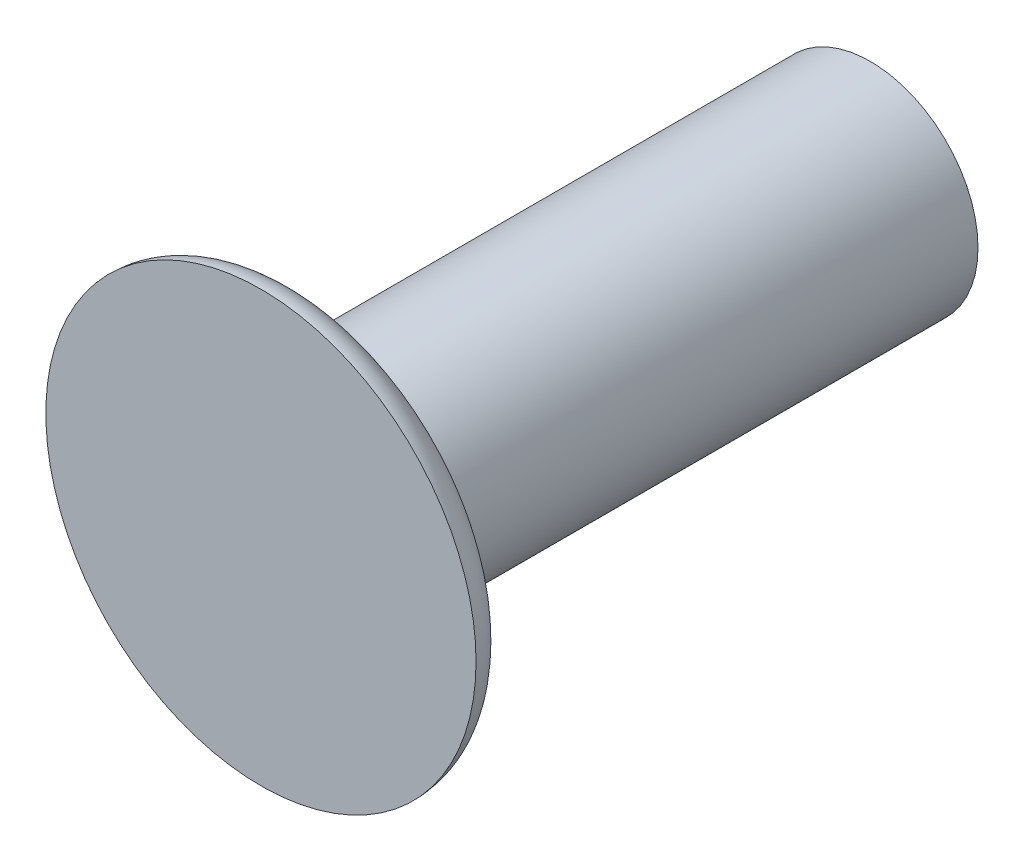
ISO-10303-21;
HEADER;
FILE_DESCRIPTION(('STEP AP214'),'2;1');
FILE_NAME('part.step','',(''),(''),'','','');
FILE_SCHEMA(('AUTOMOTIVE_DESIGN { 1 0 10303 214 1 1 1 1 }'));
ENDSEC;
DATA;
#1=APPLICATION_CONTEXT('core data for automotive mechanical design processes');
#2=APPLICATION_PROTOCOL_DEFINITION('international standard','automotive_design',2000,#1);
#3=PRODUCT_CONTEXT('',#1,'mechanical');
#4=PRODUCT('Part','Part','',(#3));
#5=PRODUCT_RELATED_PRODUCT_CATEGORY('part','',(#4));
#6=PRODUCT_DEFINITION_FORMATION('','',#4);
#7=PRODUCT_DEFINITION_CONTEXT('part definition',#1,'design');
#8=PRODUCT_DEFINITION('design','',#6,#7);
#9=PRODUCT_DEFINITION_SHAPE('','',#8);
#10=(LENGTH_UNIT() NAMED_UNIT(*) SI_UNIT(.MILLI.,.METRE.));
#11=(NAMED_UNIT(*) PLANE_ANGLE_UNIT() SI_UNIT($,.RADIAN.));
#12=(NAMED_UNIT(*) SI_UNIT($,.STERADIAN.) SOLID_ANGLE_UNIT());
#13=UNCERTAINTY_MEASURE_WITH_UNIT(LENGTH_MEASURE(1.E-05),#10,'distance_accuracy_value','');
#14=(GEOMETRIC_REPRESENTATION_CONTEXT(3) GLOBAL_UNCERTAINTY_ASSIGNED_CONTEXT((#13)) GLOBAL_UNIT_ASSIGNED_CONTEXT((#10,
#11,#12)) REPRESENTATION_CONTEXT('',''));
#15=CARTESIAN_POINT('',(0.,0.,0.));
#16=DIRECTION('',(0.,0.,1.));
#17=DIRECTION('',(1.,0.,0.));
#18=AXIS2_PLACEMENT_3D('',#15,#16,#17);
#19=CARTESIAN_POINT('',(0.,0.,80.));
#20=DIRECTION('',(0.,0.,-1.));
#21=DIRECTION('',(-1.,0.,0.));
#22=AXIS2_PLACEMENT_3D('',#19,#20,#21);
#23=CYLINDRICAL_SURFACE('',#22,15.);
#24=CARTESIAN_POINT('',(0.,0.,75.));
#25=DIRECTION('',(0.,0.,1.));
#26=DIRECTION('',(1.,0.,0.));
#27=AXIS2_PLACEMENT_3D('',#24,#25,#26);
#28=CIRCLE('',#27,15.);
#29=CARTESIAN_POINT('',(15.,0.,75.));
#30=VERTEX_POINT('',#29);
#31=EDGE_CURVE('E10',#30,#30,#28,.F.);
#32=ORIENTED_EDGE('',*,*,#31,.T.);
#33=EDGE_LOOP('',(#32));
#34=FACE_BOUND('',#33,.T.);
#35=CARTESIAN_POINT('',(0.,0.,0.));
#36=DIRECTION('',(0.,0.,1.));
#37=DIRECTION('',(1.,0.,0.));
#38=AXIS2_PLACEMENT_3D('',#35,#36,#37);
#39=CIRCLE('',#38,15.);
#40=CARTESIAN_POINT('',(15.,0.,0.));
#41=VERTEX_POINT('',#40);
#42=EDGE_CURVE('E46',#41,#41,#39,.T.);
#43=ORIENTED_EDGE('',*,*,#42,.T.);
#44=EDGE_LOOP('',(#43));
#45=FACE_BOUND('',#44,.T.);
#46=ADVANCED_FACE('F31',(#34,#45),#23,.T.);
#47=CARTESIAN_POINT('',(0.,0.,0.));
#48=DIRECTION('',(0.,0.,1.));
#49=DIRECTION('',(1.,0.,0.));
#50=AXIS2_PLACEMENT_3D('',#47,#48,#49);
#51=PLANE('',#50);
#52=CARTESIAN_POINT('',(0.,5.,0.));
#53=DIRECTION('',(0.,0.,-1.));
#54=DIRECTION('',(-1.,0.,0.));
#55=AXIS2_PLACEMENT_3D('',#52,#53,#54);
#56=CIRCLE('',#55,2.);
#57=CARTESIAN_POINT('',(-2.,5.,0.));
#58=VERTEX_POINT('',#57);
#59=EDGE_CURVE('E61',#58,#58,#56,.T.);
#60=ORIENTED_EDGE('',*,*,#59,.F.);
#61=EDGE_LOOP('',(#60));
#62=FACE_BOUND('',#61,.T.);
#63=CARTESIAN_POINT('',(0.,-5.,0.));
#64=DIRECTION('',(0.,0.,-1.));
#65=DIRECTION('',(-1.,0.,0.));
#66=AXIS2_PLACEMENT_3D('',#63,#64,#65);
#67=CIRCLE('',#66,2.);
#68=CARTESIAN_POINT('',(-2.,-5.,0.));
#69=VERTEX_POINT('',#68);
#70=EDGE_CURVE('E55',#69,#69,#67,.T.);
#71=ORIENTED_EDGE('',*,*,#70,.F.);
#72=EDGE_LOOP('',(#71));
#73=FACE_BOUND('',#72,.T.);
#74=ORIENTED_EDGE('',*,*,#42,.F.);
#75=EDGE_LOOP('',(#74));
#76=FACE_BOUND('',#75,.T.);
#77=ADVANCED_FACE('F76',(#62,#73,#76),#51,.F.);
#78=CARTESIAN_POINT('',(0.,0.,85.));
#79=DIRECTION('',(0.,0.,1.));
#80=DIRECTION('',(1.,0.,0.));
#81=AXIS2_PLACEMENT_3D('',#78,#79,#80);
#82=PLANE('',#81);
#83=CARTESIAN_POINT('',(0.,0.,85.));
#84=DIRECTION('',(0.,0.,1.));
#85=DIRECTION('',(1.,0.,0.));
#86=AXIS2_PLACEMENT_3D('',#83,#84,#85);
#87=CIRCLE('',#86,30.);
#88=CARTESIAN_POINT('',(30.,0.,85.));
#89=VERTEX_POINT('',#88);
#90=EDGE_CURVE('E51',#89,#89,#87,.T.);
#91=ORIENTED_EDGE('',*,*,#90,.T.);
#92=EDGE_LOOP('',(#91));
#93=FACE_BOUND('',#92,.T.);
#94=ADVANCED_FACE('F79',(#93),#82,.T.);
#95=CARTESIAN_POINT('',(0.,0.,80.));
#96=DIRECTION('',(0.,0.,1.));
#97=DIRECTION('',(1.,0.,0.));
#98=AXIS2_PLACEMENT_3D('',#95,#96,#97);
#99=PLANE('',#98);
#100=CARTESIAN_POINT('',(0.,0.,80.));
#101=DIRECTION('',(0.,0.,1.));
#102=DIRECTION('',(1.,0.,0.));
#103=AXIS2_PLACEMENT_3D('',#100,#101,#102);
#104=CIRCLE('',#103,25.);
#105=CARTESIAN_POINT('',(25.,0.,80.));
#106=VERTEX_POINT('',#105);
#107=EDGE_CURVE('E38',#106,#106,#104,.F.);
#108=ORIENTED_EDGE('',*,*,#107,.T.);
#109=EDGE_LOOP('',(#108));
#110=FACE_BOUND('',#109,.T.);
#111=CARTESIAN_POINT('',(0.,0.,80.));
#112=DIRECTION('',(0.,0.,1.));
#113=DIRECTION('',(1.,0.,0.));
#114=AXIS2_PLACEMENT_3D('',#111,#112,#113);
#115=CIRCLE('',#114,20.);
#116=CARTESIAN_POINT('',(20.,0.,80.));
#117=VERTEX_POINT('',#116);
#118=EDGE_CURVE('E42',#117,#117,#115,.T.);
#119=ORIENTED_EDGE('',*,*,#118,.T.);
#120=EDGE_LOOP('',(#119));
#121=FACE_BOUND('',#120,.T.);
#122=ADVANCED_FACE('F92',(#110,#121),#99,.F.);
#123=CARTESIAN_POINT('',(0.,0.,85.));
#124=DIRECTION('',(0.,0.,1.));
#125=DIRECTION('',(1.,0.,0.));
#126=AXIS2_PLACEMENT_3D('',#123,#124,#125);
#127=TOROIDAL_SURFACE('',#126,25.,5.);
#128=ORIENTED_EDGE('',*,*,#107,.F.);
#129=EDGE_LOOP('',(#128));
#130=FACE_BOUND('',#129,.T.);
#131=ORIENTED_EDGE('',*,*,#90,.F.);
#132=EDGE_LOOP('',(#131));
#133=FACE_BOUND('',#132,.T.);
#134=ADVANCED_FACE('F90',(#130,#133),#127,.T.);
#135=CARTESIAN_POINT('',(0.,0.,75.));
#136=DIRECTION('',(0.,0.,1.));
#137=DIRECTION('',(1.,0.,0.));
#138=AXIS2_PLACEMENT_3D('',#135,#136,#137);
#139=TOROIDAL_SURFACE('',#138,20.,5.);
#140=ORIENTED_EDGE('',*,*,#31,.F.);
#141=EDGE_LOOP('',(#140));
#142=FACE_BOUND('',#141,.T.);
#143=ORIENTED_EDGE('',*,*,#118,.F.);
#144=EDGE_LOOP('',(#143));
#145=FACE_BOUND('',#144,.T.);
#146=ADVANCED_FACE('F33',(#142,#145),#139,.F.);
#147=CARTESIAN_POINT('',(0.,-5.,5.));
#148=DIRECTION('',(0.,0.,-1.));
#149=DIRECTION('',(-1.,0.,0.));
#150=AXIS2_PLACEMENT_3D('',#147,#148,#149);
#151=CYLINDRICAL_SURFACE('',#150,2.);
#152=CARTESIAN_POINT('',(0.,-5.,5.));
#153=DIRECTION('',(0.,0.,-1.));
#154=DIRECTION('',(-1.,0.,0.));
#155=AXIS2_PLACEMENT_3D('',#152,#153,#154);
#156=CIRCLE('',#155,2.);
#157=CARTESIAN_POINT('',(-2.,-5.,5.));
#158=VERTEX_POINT('',#157);
#159=EDGE_CURVE('E58',#158,#158,#156,.T.);
#160=ORIENTED_EDGE('',*,*,#159,.F.);
#161=EDGE_LOOP('',(#160));
#162=FACE_BOUND('',#161,.T.);
#163=ORIENTED_EDGE('',*,*,#70,.T.);
#164=EDGE_LOOP('',(#163));
#165=FACE_BOUND('',#164,.T.);
#166=ADVANCED_FACE('F98',(#162,#165),#151,.F.);
#167=CARTESIAN_POINT('',(0.,-5.,5.));
#168=DIRECTION('',(0.,0.,-1.));
#169=DIRECTION('',(-1.,0.,0.));
#170=AXIS2_PLACEMENT_3D('',#167,#168,#169);
#171=PLANE('',#170);
#172=ORIENTED_EDGE('',*,*,#159,.T.);
#173=EDGE_LOOP('',(#172));
#174=FACE_BOUND('',#173,.T.);
#175=ADVANCED_FACE('F72',(#174),#171,.T.);
#176=CARTESIAN_POINT('',(0.,5.,5.));
#177=DIRECTION('',(0.,0.,-1.));
#178=DIRECTION('',(-1.,0.,0.));
#179=AXIS2_PLACEMENT_3D('',#176,#177,#178);
#180=CYLINDRICAL_SURFACE('',#179,2.);
#181=CARTESIAN_POINT('',(0.,5.,5.));
#182=DIRECTION('',(0.,0.,-1.));
#183=DIRECTION('',(-1.,0.,0.));
#184=AXIS2_PLACEMENT_3D('',#181,#182,#183);
#185=CIRCLE('',#184,2.);
#186=CARTESIAN_POINT('',(-2.,5.,5.));
#187=VERTEX_POINT('',#186);
#188=EDGE_CURVE('E54',#187,#187,#185,.T.);
#189=ORIENTED_EDGE('',*,*,#188,.F.);
#190=EDGE_LOOP('',(#189));
#191=FACE_BOUND('',#190,.T.);
#192=ORIENTED_EDGE('',*,*,#59,.T.);
#193=EDGE_LOOP('',(#192));
#194=FACE_BOUND('',#193,.T.);
#195=ADVANCED_FACE('F69',(#191,#194),#180,.F.);
#196=CARTESIAN_POINT('',(0.,5.,5.));
#197=DIRECTION('',(0.,0.,-1.));
#198=DIRECTION('',(-1.,0.,0.));
#199=AXIS2_PLACEMENT_3D('',#196,#197,#198);
#200=PLANE('',#199);
#201=ORIENTED_EDGE('',*,*,#188,.T.);
#202=EDGE_LOOP('',(#201));
#203=FACE_BOUND('',#202,.T.);
#204=ADVANCED_FACE('F67',(#203),#200,.T.);
#205=CLOSED_SHELL('',(#46,#77,#94,#122,#134,#146,#166,#175,#195,#204));
#206=MANIFOLD_SOLID_BREP('B2',#205);
#207=ADVANCED_BREP_SHAPE_REPRESENTATION('',(#18,#206),#14);
#208=SHAPE_DEFINITION_REPRESENTATION(#9,#207);
ENDSEC;
END-ISO-10303-21;
